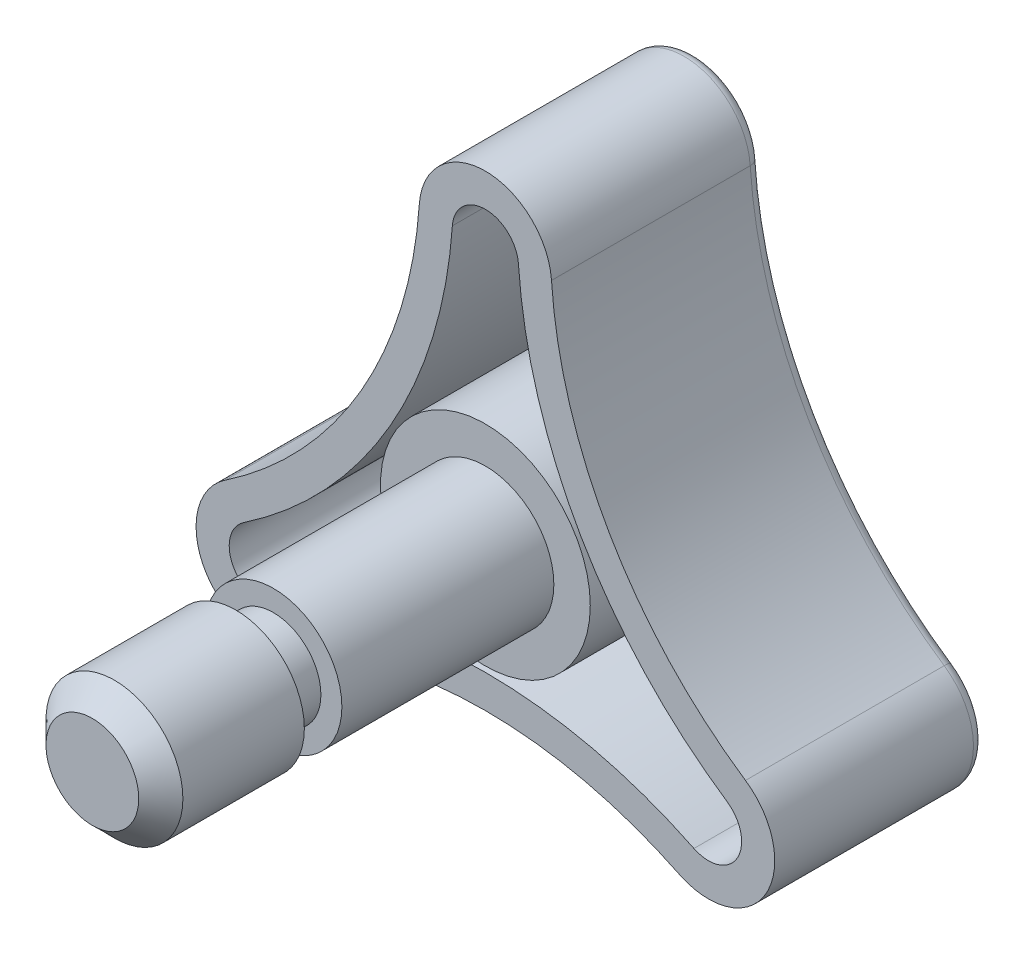
ISO-10303-21;
HEADER;
FILE_DESCRIPTION(('STEP AP214'),'2;1');
FILE_NAME('part.step','',(''),(''),'','','');
FILE_SCHEMA(('AUTOMOTIVE_DESIGN { 1 0 10303 214 1 1 1 1 }'));
ENDSEC;
DATA;
#1=APPLICATION_CONTEXT('core data for automotive mechanical design processes');
#2=APPLICATION_PROTOCOL_DEFINITION('international standard','automotive_design',2000,#1);
#3=PRODUCT_CONTEXT('',#1,'mechanical');
#4=PRODUCT('Part','Part','',(#3));
#5=PRODUCT_RELATED_PRODUCT_CATEGORY('part','',(#4));
#6=PRODUCT_DEFINITION_FORMATION('','',#4);
#7=PRODUCT_DEFINITION_CONTEXT('part definition',#1,'design');
#8=PRODUCT_DEFINITION('design','',#6,#7);
#9=PRODUCT_DEFINITION_SHAPE('','',#8);
#10=(LENGTH_UNIT() NAMED_UNIT(*) SI_UNIT(.MILLI.,.METRE.));
#11=(NAMED_UNIT(*) PLANE_ANGLE_UNIT() SI_UNIT($,.RADIAN.));
#12=(NAMED_UNIT(*) SI_UNIT($,.STERADIAN.) SOLID_ANGLE_UNIT());
#13=UNCERTAINTY_MEASURE_WITH_UNIT(LENGTH_MEASURE(1.E-05),#10,'distance_accuracy_value','');
#14=(GEOMETRIC_REPRESENTATION_CONTEXT(3) GLOBAL_UNCERTAINTY_ASSIGNED_CONTEXT((#13)) GLOBAL_UNIT_ASSIGNED_CONTEXT((#10,
#11,#12)) REPRESENTATION_CONTEXT('',''));
#15=CARTESIAN_POINT('',(0.,0.,0.));
#16=DIRECTION('',(0.,0.,1.));
#17=DIRECTION('',(1.,0.,0.));
#18=AXIS2_PLACEMENT_3D('',#15,#16,#17);
#19=CARTESIAN_POINT('',(0.,0.,27.3));
#20=DIRECTION('',(0.,0.,-1.));
#21=DIRECTION('',(-1.,0.,0.));
#22=AXIS2_PLACEMENT_3D('',#19,#20,#21);
#23=CYLINDRICAL_SURFACE('',#22,3.1);
#24=CARTESIAN_POINT('',(0.,0.,9.5));
#25=DIRECTION('',(0.,0.,1.));
#26=DIRECTION('',(1.,0.,0.));
#27=AXIS2_PLACEMENT_3D('',#24,#25,#26);
#28=CIRCLE('',#27,3.1);
#29=CARTESIAN_POINT('',(3.1,0.,9.5));
#30=VERTEX_POINT('',#29);
#31=EDGE_CURVE('E247',#30,#30,#28,.T.);
#32=ORIENTED_EDGE('',*,*,#31,.T.);
#33=EDGE_LOOP('',(#32));
#34=FACE_BOUND('',#33,.T.);
#35=CARTESIAN_POINT('',(0.,0.,19.1));
#36=DIRECTION('',(0.,0.,1.));
#37=DIRECTION('',(1.,0.,0.));
#38=AXIS2_PLACEMENT_3D('',#35,#36,#37);
#39=CIRCLE('',#38,3.1);
#40=CARTESIAN_POINT('',(3.1,0.,19.1));
#41=VERTEX_POINT('',#40);
#42=EDGE_CURVE('E268',#41,#41,#39,.T.);
#43=ORIENTED_EDGE('',*,*,#42,.F.);
#44=EDGE_LOOP('',(#43));
#45=FACE_BOUND('',#44,.T.);
#46=ADVANCED_FACE('F33',(#34,#45),#23,.T.);
#47=CARTESIAN_POINT('',(0.,-26.4952951633887,9.5));
#48=DIRECTION('',(0.,0.,-1.));
#49=DIRECTION('',(-1.,0.,0.));
#50=AXIS2_PLACEMENT_3D('',#47,#48,#49);
#51=CYLINDRICAL_SURFACE('',#50,20.);
#52=DIRECTION('',(0.,0.,-1.));
#53=VECTOR('',#52,1.);
#54=CARTESIAN_POINT('',(-8.78576496592908,-8.52837183290578,9.5));
#55=LINE('',#54,#53);
#56=CARTESIAN_POINT('',(-8.78576496592908,-8.52837183290578,9.5));
#57=VERTEX_POINT('',#56);
#58=CARTESIAN_POINT('',(-8.78576496592908,-8.52837183290578,0.5));
#59=VERTEX_POINT('',#58);
#60=EDGE_CURVE('E208',#57,#59,#55,.T.);
#61=ORIENTED_EDGE('',*,*,#60,.T.);
#62=CARTESIAN_POINT('',(0.,-26.4952951633887,0.5));
#63=DIRECTION('',(0.,0.,1.));
#64=DIRECTION('',(1.,0.,0.));
#65=AXIS2_PLACEMENT_3D('',#62,#63,#64);
#66=CIRCLE('',#65,20.);
#67=CARTESIAN_POINT('',(8.78576496592909,-8.52837183290578,0.5));
#68=VERTEX_POINT('',#67);
#69=EDGE_CURVE('E243',#59,#68,#66,.F.);
#70=ORIENTED_EDGE('',*,*,#69,.T.);
#71=DIRECTION('',(0.,0.,-1.));
#72=VECTOR('',#71,1.);
#73=CARTESIAN_POINT('',(8.78576496592909,-8.52837183290578,9.5));
#74=LINE('',#73,#72);
#75=CARTESIAN_POINT('',(8.78576496592909,-8.52837183290578,9.5));
#76=VERTEX_POINT('',#75);
#77=EDGE_CURVE('E220',#76,#68,#74,.T.);
#78=ORIENTED_EDGE('',*,*,#77,.F.);
#79=CARTESIAN_POINT('',(0.,-26.4952951633887,9.5));
#80=DIRECTION('',(0.,0.,-1.));
#81=DIRECTION('',(1.,0.,0.));
#82=AXIS2_PLACEMENT_3D('',#79,#80,#81);
#83=CIRCLE('',#82,20.);
#84=EDGE_CURVE('E195',#57,#76,#83,.T.);
#85=ORIENTED_EDGE('',*,*,#84,.F.);
#86=EDGE_LOOP('',(#61,#70,#78,#85));
#87=FACE_BOUND('',#86,.T.);
#88=ADVANCED_FACE('F318',(#87),#51,.F.);
#89=CARTESIAN_POINT('',(10.1036297108185,-5.83333333333333,9.5));
#90=DIRECTION('',(0.,0.,-1.));
#91=DIRECTION('',(-1.,0.,0.));
#92=AXIS2_PLACEMENT_3D('',#89,#90,#91);
#93=CYLINDRICAL_SURFACE('',#92,3.);
#94=ORIENTED_EDGE('',*,*,#77,.T.);
#95=CARTESIAN_POINT('',(10.1036297108185,-5.83333333333333,0.5));
#96=DIRECTION('',(0.,0.,1.));
#97=DIRECTION('',(1.,0.,0.));
#98=AXIS2_PLACEMENT_3D('',#95,#96,#97);
#99=CIRCLE('',#98,3.);
#100=CARTESIAN_POINT('',(11.7786691431806,-3.34450973572102,0.5));
#101=VERTEX_POINT('',#100);
#102=EDGE_CURVE('E241',#68,#101,#99,.T.);
#103=ORIENTED_EDGE('',*,*,#102,.T.);
#104=DIRECTION('',(0.,0.,-1.));
#105=VECTOR('',#104,1.);
#106=CARTESIAN_POINT('',(11.7786691431806,-3.34450973572102,9.5));
#107=LINE('',#106,#105);
#108=CARTESIAN_POINT('',(11.7786691431806,-3.34450973572102,9.5));
#109=VERTEX_POINT('',#108);
#110=EDGE_CURVE('E217',#109,#101,#107,.T.);
#111=ORIENTED_EDGE('',*,*,#110,.F.);
#112=CARTESIAN_POINT('',(10.1036297108185,-5.83333333333333,9.5));
#113=DIRECTION('',(0.,0.,1.));
#114=DIRECTION('',(1.,0.,0.));
#115=AXIS2_PLACEMENT_3D('',#112,#113,#114);
#116=CIRCLE('',#115,3.);
#117=EDGE_CURVE('E198',#76,#109,#116,.T.);
#118=ORIENTED_EDGE('',*,*,#117,.F.);
#119=EDGE_LOOP('',(#94,#103,#111,#118));
#120=FACE_BOUND('',#119,.T.);
#121=ADVANCED_FACE('F324',(#120),#93,.T.);
#122=CARTESIAN_POINT('',(22.9455986922616,13.2476475816944,9.5));
#123=DIRECTION('',(0.,0.,-1.));
#124=DIRECTION('',(-1.,0.,0.));
#125=AXIS2_PLACEMENT_3D('',#122,#123,#124);
#126=CYLINDRICAL_SURFACE('',#125,20.);
#127=ORIENTED_EDGE('',*,*,#110,.T.);
#128=CARTESIAN_POINT('',(22.9455986922616,13.2476475816944,0.5));
#129=DIRECTION('',(0.,0.,1.));
#130=DIRECTION('',(1.,0.,0.));
#131=AXIS2_PLACEMENT_3D('',#128,#129,#130);
#132=CIRCLE('',#131,20.);
#133=CARTESIAN_POINT('',(2.99290417725151,11.8728815686268,0.5));
#134=VERTEX_POINT('',#133);
#135=EDGE_CURVE('E239',#101,#134,#132,.F.);
#136=ORIENTED_EDGE('',*,*,#135,.T.);
#137=DIRECTION('',(0.,0.,-1.));
#138=VECTOR('',#137,1.);
#139=CARTESIAN_POINT('',(2.99290417725151,11.8728815686268,9.5));
#140=LINE('',#139,#138);
#141=CARTESIAN_POINT('',(2.99290417725151,11.8728815686268,9.5));
#142=VERTEX_POINT('',#141);
#143=EDGE_CURVE('E214',#142,#134,#140,.T.);
#144=ORIENTED_EDGE('',*,*,#143,.F.);
#145=CARTESIAN_POINT('',(22.9455986922616,13.2476475816944,9.5));
#146=DIRECTION('',(0.,0.,-1.));
#147=DIRECTION('',(1.,0.,0.));
#148=AXIS2_PLACEMENT_3D('',#145,#146,#147);
#149=CIRCLE('',#148,20.);
#150=EDGE_CURVE('E200',#109,#142,#149,.T.);
#151=ORIENTED_EDGE('',*,*,#150,.F.);
#152=EDGE_LOOP('',(#127,#136,#144,#151));
#153=FACE_BOUND('',#152,.T.);
#154=ADVANCED_FACE('F418',(#153),#126,.F.);
#155=CARTESIAN_POINT('',(0.,11.6666666666667,9.5));
#156=DIRECTION('',(0.,0.,-1.));
#157=DIRECTION('',(-1.,0.,0.));
#158=AXIS2_PLACEMENT_3D('',#155,#156,#157);
#159=CYLINDRICAL_SURFACE('',#158,3.);
#160=ORIENTED_EDGE('',*,*,#143,.T.);
#161=CARTESIAN_POINT('',(0.,11.6666666666667,0.5));
#162=DIRECTION('',(0.,0.,1.));
#163=DIRECTION('',(1.,0.,0.));
#164=AXIS2_PLACEMENT_3D('',#161,#162,#163);
#165=CIRCLE('',#164,3.);
#166=CARTESIAN_POINT('',(-2.99290417725151,11.8728815686268,0.5));
#167=VERTEX_POINT('',#166);
#168=EDGE_CURVE('E223',#134,#167,#165,.T.);
#169=ORIENTED_EDGE('',*,*,#168,.T.);
#170=DIRECTION('',(0.,0.,-1.));
#171=VECTOR('',#170,1.);
#172=CARTESIAN_POINT('',(-2.99290417725151,11.8728815686268,9.5));
#173=LINE('',#172,#171);
#174=CARTESIAN_POINT('',(-2.99290417725151,11.8728815686268,9.5));
#175=VERTEX_POINT('',#174);
#176=EDGE_CURVE('E212',#175,#167,#173,.T.);
#177=ORIENTED_EDGE('',*,*,#176,.F.);
#178=CARTESIAN_POINT('',(0.,11.6666666666667,9.5));
#179=DIRECTION('',(0.,0.,1.));
#180=DIRECTION('',(1.,0.,0.));
#181=AXIS2_PLACEMENT_3D('',#178,#179,#180);
#182=CIRCLE('',#181,3.);
#183=EDGE_CURVE('E202',#142,#175,#182,.T.);
#184=ORIENTED_EDGE('',*,*,#183,.F.);
#185=EDGE_LOOP('',(#160,#169,#177,#184));
#186=FACE_BOUND('',#185,.T.);
#187=ADVANCED_FACE('F428',(#186),#159,.T.);
#188=CARTESIAN_POINT('',(-22.9455986922616,13.2476475816944,9.5));
#189=DIRECTION('',(0.,0.,-1.));
#190=DIRECTION('',(-1.,0.,0.));
#191=AXIS2_PLACEMENT_3D('',#188,#189,#190);
#192=CYLINDRICAL_SURFACE('',#191,20.);
#193=ORIENTED_EDGE('',*,*,#176,.T.);
#194=CARTESIAN_POINT('',(-22.9455986922616,13.2476475816944,0.5));
#195=DIRECTION('',(0.,0.,1.));
#196=DIRECTION('',(1.,0.,0.));
#197=AXIS2_PLACEMENT_3D('',#194,#195,#196);
#198=CIRCLE('',#197,20.);
#199=CARTESIAN_POINT('',(-11.7786691431806,-3.34450973572102,0.5));
#200=VERTEX_POINT('',#199);
#201=EDGE_CURVE('E48',#167,#200,#198,.F.);
#202=ORIENTED_EDGE('',*,*,#201,.T.);
#203=DIRECTION('',(0.,0.,-1.));
#204=VECTOR('',#203,1.);
#205=CARTESIAN_POINT('',(-11.7786691431806,-3.34450973572102,9.5));
#206=LINE('',#205,#204);
#207=CARTESIAN_POINT('',(-11.7786691431806,-3.34450973572102,9.5));
#208=VERTEX_POINT('',#207);
#209=EDGE_CURVE('E210',#208,#200,#206,.T.);
#210=ORIENTED_EDGE('',*,*,#209,.F.);
#211=CARTESIAN_POINT('',(-22.9455986922616,13.2476475816944,9.5));
#212=DIRECTION('',(0.,0.,-1.));
#213=DIRECTION('',(1.,0.,0.));
#214=AXIS2_PLACEMENT_3D('',#211,#212,#213);
#215=CIRCLE('',#214,20.);
#216=EDGE_CURVE('E204',#175,#208,#215,.T.);
#217=ORIENTED_EDGE('',*,*,#216,.F.);
#218=EDGE_LOOP('',(#193,#202,#210,#217));
#219=FACE_BOUND('',#218,.T.);
#220=ADVANCED_FACE('F438',(#219),#192,.F.);
#221=CARTESIAN_POINT('',(-10.1036297108184,-5.83333333333333,9.5));
#222=DIRECTION('',(0.,0.,-1.));
#223=DIRECTION('',(-1.,0.,0.));
#224=AXIS2_PLACEMENT_3D('',#221,#222,#223);
#225=CYLINDRICAL_SURFACE('',#224,3.);
#226=ORIENTED_EDGE('',*,*,#209,.T.);
#227=CARTESIAN_POINT('',(-10.1036297108184,-5.83333333333333,0.5));
#228=DIRECTION('',(0.,0.,1.));
#229=DIRECTION('',(1.,0.,0.));
#230=AXIS2_PLACEMENT_3D('',#227,#228,#229);
#231=CIRCLE('',#230,3.);
#232=EDGE_CURVE('E55',#200,#59,#231,.T.);
#233=ORIENTED_EDGE('',*,*,#232,.T.);
#234=ORIENTED_EDGE('',*,*,#60,.F.);
#235=CARTESIAN_POINT('',(-10.1036297108184,-5.83333333333333,9.5));
#236=DIRECTION('',(0.,0.,1.));
#237=DIRECTION('',(1.,0.,0.));
#238=AXIS2_PLACEMENT_3D('',#235,#236,#237);
#239=CIRCLE('',#238,3.);
#240=EDGE_CURVE('E206',#208,#57,#239,.T.);
#241=ORIENTED_EDGE('',*,*,#240,.F.);
#242=EDGE_LOOP('',(#226,#233,#234,#241));
#243=FACE_BOUND('',#242,.T.);
#244=ADVANCED_FACE('F448',(#243),#225,.T.);
#245=CARTESIAN_POINT('',(-5.05181485540922,-16.164314248361,9.5));
#246=DIRECTION('',(0.,0.,1.));
#247=DIRECTION('',(1.,0.,0.));
#248=AXIS2_PLACEMENT_3D('',#245,#246,#247);
#249=PLANE('',#248);
#250=CARTESIAN_POINT('',(0.,-26.4952951633887,9.5));
#251=DIRECTION('',(0.,0.,1.));
#252=DIRECTION('',(1.,0.,0.));
#253=AXIS2_PLACEMENT_3D('',#250,#251,#252);
#254=CIRCLE('',#253,21.5);
#255=CARTESIAN_POINT('',(-9.44469733837376,-7.18085258311956,9.5));
#256=VERTEX_POINT('',#255);
#257=CARTESIAN_POINT('',(9.44469733837377,-7.18085258311955,9.5));
#258=VERTEX_POINT('',#257);
#259=EDGE_CURVE('E183',#256,#258,#254,.F.);
#260=ORIENTED_EDGE('',*,*,#259,.F.);
#261=CARTESIAN_POINT('',(-10.1036297108184,-5.83333333333333,9.5));
#262=DIRECTION('',(0.,0.,1.));
#263=DIRECTION('',(1.,0.,0.));
#264=AXIS2_PLACEMENT_3D('',#261,#262,#263);
#265=CIRCLE('',#264,1.5);
#266=CARTESIAN_POINT('',(-10.9411494269995,-4.58892153452717,9.5));
#267=VERTEX_POINT('',#266);
#268=EDGE_CURVE('E193',#267,#256,#265,.T.);
#269=ORIENTED_EDGE('',*,*,#268,.F.);
#270=CARTESIAN_POINT('',(-22.9455986922616,13.2476475816944,9.5));
#271=DIRECTION('',(0.,0.,1.));
#272=DIRECTION('',(1.,0.,0.));
#273=AXIS2_PLACEMENT_3D('',#270,#271,#272);
#274=CIRCLE('',#273,21.5);
#275=CARTESIAN_POINT('',(-1.49645208862575,11.7697741176467,9.5));
#276=VERTEX_POINT('',#275);
#277=EDGE_CURVE('E190',#276,#267,#274,.F.);
#278=ORIENTED_EDGE('',*,*,#277,.F.);
#279=CARTESIAN_POINT('',(0.,11.6666666666667,9.5));
#280=DIRECTION('',(0.,0.,1.));
#281=DIRECTION('',(1.,0.,0.));
#282=AXIS2_PLACEMENT_3D('',#279,#280,#281);
#283=CIRCLE('',#282,1.5);
#284=CARTESIAN_POINT('',(1.49645208862575,11.7697741176467,9.5));
#285=VERTEX_POINT('',#284);
#286=EDGE_CURVE('E188',#285,#276,#283,.T.);
#287=ORIENTED_EDGE('',*,*,#286,.F.);
#288=CARTESIAN_POINT('',(22.9455986922616,13.2476475816944,9.5));
#289=DIRECTION('',(0.,0.,1.));
#290=DIRECTION('',(1.,0.,0.));
#291=AXIS2_PLACEMENT_3D('',#288,#289,#290);
#292=CIRCLE('',#291,21.5);
#293=CARTESIAN_POINT('',(10.9411494269995,-4.58892153452718,9.5));
#294=VERTEX_POINT('',#293);
#295=EDGE_CURVE('E186',#294,#285,#292,.F.);
#296=ORIENTED_EDGE('',*,*,#295,.F.);
#297=CARTESIAN_POINT('',(10.1036297108185,-5.83333333333333,9.5));
#298=DIRECTION('',(0.,0.,1.));
#299=DIRECTION('',(1.,0.,0.));
#300=AXIS2_PLACEMENT_3D('',#297,#298,#299);
#301=CIRCLE('',#300,1.5);
#302=EDGE_CURVE('E158',#258,#294,#301,.T.);
#303=ORIENTED_EDGE('',*,*,#302,.F.);
#304=EDGE_LOOP('',(#260,#269,#278,#287,#296,#303));
#305=FACE_BOUND('',#304,.T.);
#306=ORIENTED_EDGE('',*,*,#84,.T.);
#307=ORIENTED_EDGE('',*,*,#117,.T.);
#308=ORIENTED_EDGE('',*,*,#150,.T.);
#309=ORIENTED_EDGE('',*,*,#183,.T.);
#310=ORIENTED_EDGE('',*,*,#216,.T.);
#311=ORIENTED_EDGE('',*,*,#240,.T.);
#312=EDGE_LOOP('',(#306,#307,#308,#309,#310,#311));
#313=FACE_BOUND('',#312,.T.);
#314=ADVANCED_FACE('F299',(#305,#313),#249,.T.);
#315=CARTESIAN_POINT('',(-5.05181485540922,-16.164314248361,0.));
#316=DIRECTION('',(0.,0.,1.));
#317=DIRECTION('',(1.,0.,0.));
#318=AXIS2_PLACEMENT_3D('',#315,#316,#317);
#319=PLANE('',#318);
#320=CARTESIAN_POINT('',(-22.9455986922616,13.2476475816944,0.));
#321=DIRECTION('',(0.,0.,1.));
#322=DIRECTION('',(1.,0.,0.));
#323=AXIS2_PLACEMENT_3D('',#320,#321,#322);
#324=CIRCLE('',#323,20.5);
#325=CARTESIAN_POINT('',(-11.4994959044536,-3.75931366865641,0.));
#326=VERTEX_POINT('',#325);
#327=CARTESIAN_POINT('',(-2.49408681437626,11.8385124183001,0.));
#328=VERTEX_POINT('',#327);
#329=EDGE_CURVE('E226',#326,#328,#324,.T.);
#330=ORIENTED_EDGE('',*,*,#329,.T.);
#331=CARTESIAN_POINT('',(0.,11.6666666666667,0.));
#332=DIRECTION('',(0.,0.,1.));
#333=DIRECTION('',(1.,0.,0.));
#334=AXIS2_PLACEMENT_3D('',#331,#332,#333);
#335=CIRCLE('',#334,2.5);
#336=CARTESIAN_POINT('',(2.49408681437626,11.8385124183001,0.));
#337=VERTEX_POINT('',#336);
#338=EDGE_CURVE('E236',#328,#337,#335,.F.);
#339=ORIENTED_EDGE('',*,*,#338,.T.);
#340=CARTESIAN_POINT('',(22.9455986922616,13.2476475816944,0.));
#341=DIRECTION('',(0.,0.,1.));
#342=DIRECTION('',(1.,0.,0.));
#343=AXIS2_PLACEMENT_3D('',#340,#341,#342);
#344=CIRCLE('',#343,20.5);
#345=CARTESIAN_POINT('',(11.4994959044536,-3.75931366865641,0.));
#346=VERTEX_POINT('',#345);
#347=EDGE_CURVE('E234',#337,#346,#344,.T.);
#348=ORIENTED_EDGE('',*,*,#347,.T.);
#349=CARTESIAN_POINT('',(10.1036297108185,-5.83333333333333,0.));
#350=DIRECTION('',(0.,0.,1.));
#351=DIRECTION('',(1.,0.,0.));
#352=AXIS2_PLACEMENT_3D('',#349,#350,#351);
#353=CIRCLE('',#352,2.5);
#354=CARTESIAN_POINT('',(9.00540909007732,-8.0791987496437,0.));
#355=VERTEX_POINT('',#354);
#356=EDGE_CURVE('E232',#346,#355,#353,.F.);
#357=ORIENTED_EDGE('',*,*,#356,.T.);
#358=CARTESIAN_POINT('',(0.,-26.4952951633887,0.));
#359=DIRECTION('',(0.,0.,1.));
#360=DIRECTION('',(1.,0.,0.));
#361=AXIS2_PLACEMENT_3D('',#358,#359,#360);
#362=CIRCLE('',#361,20.5);
#363=CARTESIAN_POINT('',(-9.00540909007731,-8.0791987496437,0.));
#364=VERTEX_POINT('',#363);
#365=EDGE_CURVE('E230',#355,#364,#362,.T.);
#366=ORIENTED_EDGE('',*,*,#365,.T.);
#367=CARTESIAN_POINT('',(-10.1036297108184,-5.83333333333333,0.));
#368=DIRECTION('',(0.,0.,1.));
#369=DIRECTION('',(1.,0.,0.));
#370=AXIS2_PLACEMENT_3D('',#367,#368,#369);
#371=CIRCLE('',#370,2.5);
#372=EDGE_CURVE('E228',#364,#326,#371,.F.);
#373=ORIENTED_EDGE('',*,*,#372,.T.);
#374=EDGE_LOOP('',(#330,#339,#348,#357,#366,#373));
#375=FACE_BOUND('',#374,.T.);
#376=ADVANCED_FACE('F379',(#375),#319,.F.);
#377=CARTESIAN_POINT('',(0.,-26.4952951633887,9.5));
#378=DIRECTION('',(0.,0.,-1.));
#379=DIRECTION('',(-1.,0.,0.));
#380=AXIS2_PLACEMENT_3D('',#377,#378,#379);
#381=CYLINDRICAL_SURFACE('',#380,21.5);
#382=CARTESIAN_POINT('',(0.,-26.4952951633887,1.5));
#383=DIRECTION('',(0.,0.,1.));
#384=DIRECTION('',(1.,0.,0.));
#385=AXIS2_PLACEMENT_3D('',#382,#383,#384);
#386=CIRCLE('',#385,21.5);
#387=CARTESIAN_POINT('',(-9.44469733837377,-7.18085258311955,1.5));
#388=VERTEX_POINT('',#387);
#389=CARTESIAN_POINT('',(9.44469733837377,-7.18085258311955,1.5));
#390=VERTEX_POINT('',#389);
#391=EDGE_CURVE('E149',#388,#390,#386,.F.);
#392=ORIENTED_EDGE('',*,*,#391,.F.);
#393=DIRECTION('',(0.,0.,-1.));
#394=VECTOR('',#393,1.);
#395=CARTESIAN_POINT('',(-9.44469733837377,-7.18085258311955,9.5));
#396=LINE('',#395,#394);
#397=EDGE_CURVE('E181',#256,#388,#396,.T.);
#398=ORIENTED_EDGE('',*,*,#397,.F.);
#399=ORIENTED_EDGE('',*,*,#259,.T.);
#400=DIRECTION('',(0.,0.,-1.));
#401=VECTOR('',#400,1.);
#402=CARTESIAN_POINT('',(9.44469733837377,-7.18085258311955,9.5));
#403=LINE('',#402,#401);
#404=EDGE_CURVE('E161',#258,#390,#403,.T.);
#405=ORIENTED_EDGE('',*,*,#404,.T.);
#406=EDGE_LOOP('',(#392,#398,#399,#405));
#407=FACE_BOUND('',#406,.T.);
#408=ADVANCED_FACE('F297',(#407),#381,.T.);
#409=CARTESIAN_POINT('',(10.1036297108185,-5.83333333333333,9.5));
#410=DIRECTION('',(0.,0.,-1.));
#411=DIRECTION('',(-1.,0.,0.));
#412=AXIS2_PLACEMENT_3D('',#409,#410,#411);
#413=CYLINDRICAL_SURFACE('',#412,1.5);
#414=CARTESIAN_POINT('',(10.1036297108185,-5.83333333333333,1.5));
#415=DIRECTION('',(0.,0.,1.));
#416=DIRECTION('',(1.,0.,0.));
#417=AXIS2_PLACEMENT_3D('',#414,#415,#416);
#418=CIRCLE('',#417,1.5);
#419=CARTESIAN_POINT('',(10.9411494269995,-4.58892153452718,1.5));
#420=VERTEX_POINT('',#419);
#421=EDGE_CURVE('E142',#390,#420,#418,.T.);
#422=ORIENTED_EDGE('',*,*,#421,.F.);
#423=ORIENTED_EDGE('',*,*,#404,.F.);
#424=ORIENTED_EDGE('',*,*,#302,.T.);
#425=DIRECTION('',(0.,0.,-1.));
#426=VECTOR('',#425,1.);
#427=CARTESIAN_POINT('',(10.9411494269995,-4.58892153452718,9.5));
#428=LINE('',#427,#426);
#429=EDGE_CURVE('E155',#294,#420,#428,.T.);
#430=ORIENTED_EDGE('',*,*,#429,.T.);
#431=EDGE_LOOP('',(#422,#423,#424,#430));
#432=FACE_BOUND('',#431,.T.);
#433=ADVANCED_FACE('F156',(#432),#413,.F.);
#434=CARTESIAN_POINT('',(22.9455986922616,13.2476475816944,9.5));
#435=DIRECTION('',(0.,0.,-1.));
#436=DIRECTION('',(-1.,0.,0.));
#437=AXIS2_PLACEMENT_3D('',#434,#435,#436);
#438=CYLINDRICAL_SURFACE('',#437,21.5);
#439=CARTESIAN_POINT('',(22.9455986922616,13.2476475816944,1.5));
#440=DIRECTION('',(0.,0.,1.));
#441=DIRECTION('',(1.,0.,0.));
#442=AXIS2_PLACEMENT_3D('',#439,#440,#441);
#443=CIRCLE('',#442,21.5);
#444=CARTESIAN_POINT('',(1.49645208862576,11.7697741176467,1.5));
#445=VERTEX_POINT('',#444);
#446=EDGE_CURVE('E146',#420,#445,#443,.F.);
#447=ORIENTED_EDGE('',*,*,#446,.F.);
#448=ORIENTED_EDGE('',*,*,#429,.F.);
#449=ORIENTED_EDGE('',*,*,#295,.T.);
#450=DIRECTION('',(0.,0.,-1.));
#451=VECTOR('',#450,1.);
#452=CARTESIAN_POINT('',(1.49645208862576,11.7697741176467,9.5));
#453=LINE('',#452,#451);
#454=EDGE_CURVE('E162',#285,#445,#453,.T.);
#455=ORIENTED_EDGE('',*,*,#454,.T.);
#456=EDGE_LOOP('',(#447,#448,#449,#455));
#457=FACE_BOUND('',#456,.T.);
#458=ADVANCED_FACE('F164',(#457),#438,.T.);
#459=CARTESIAN_POINT('',(0.,11.6666666666667,9.5));
#460=DIRECTION('',(0.,0.,-1.));
#461=DIRECTION('',(-1.,0.,0.));
#462=AXIS2_PLACEMENT_3D('',#459,#460,#461);
#463=CYLINDRICAL_SURFACE('',#462,1.5);
#464=CARTESIAN_POINT('',(0.,11.6666666666667,1.5));
#465=DIRECTION('',(0.,0.,1.));
#466=DIRECTION('',(1.,0.,0.));
#467=AXIS2_PLACEMENT_3D('',#464,#465,#466);
#468=CIRCLE('',#467,1.5);
#469=CARTESIAN_POINT('',(-1.49645208862575,11.7697741176467,1.5));
#470=VERTEX_POINT('',#469);
#471=EDGE_CURVE('E167',#445,#470,#468,.T.);
#472=ORIENTED_EDGE('',*,*,#471,.F.);
#473=ORIENTED_EDGE('',*,*,#454,.F.);
#474=ORIENTED_EDGE('',*,*,#286,.T.);
#475=DIRECTION('',(0.,0.,-1.));
#476=VECTOR('',#475,1.);
#477=CARTESIAN_POINT('',(-1.49645208862575,11.7697741176467,9.5));
#478=LINE('',#477,#476);
#479=EDGE_CURVE('E172',#276,#470,#478,.T.);
#480=ORIENTED_EDGE('',*,*,#479,.T.);
#481=EDGE_LOOP('',(#472,#473,#474,#480));
#482=FACE_BOUND('',#481,.T.);
#483=ADVANCED_FACE('F304',(#482),#463,.F.);
#484=CARTESIAN_POINT('',(-22.9455986922616,13.2476475816944,9.5));
#485=DIRECTION('',(0.,0.,-1.));
#486=DIRECTION('',(-1.,0.,0.));
#487=AXIS2_PLACEMENT_3D('',#484,#485,#486);
#488=CYLINDRICAL_SURFACE('',#487,21.5);
#489=CARTESIAN_POINT('',(-22.9455986922616,13.2476475816944,1.5));
#490=DIRECTION('',(0.,0.,1.));
#491=DIRECTION('',(1.,0.,0.));
#492=AXIS2_PLACEMENT_3D('',#489,#490,#491);
#493=CIRCLE('',#492,21.5);
#494=CARTESIAN_POINT('',(-10.9411494269995,-4.58892153452718,1.5));
#495=VERTEX_POINT('',#494);
#496=EDGE_CURVE('E169',#470,#495,#493,.F.);
#497=ORIENTED_EDGE('',*,*,#496,.F.);
#498=ORIENTED_EDGE('',*,*,#479,.F.);
#499=ORIENTED_EDGE('',*,*,#277,.T.);
#500=DIRECTION('',(0.,0.,-1.));
#501=VECTOR('',#500,1.);
#502=CARTESIAN_POINT('',(-10.9411494269995,-4.58892153452718,9.5));
#503=LINE('',#502,#501);
#504=EDGE_CURVE('E176',#267,#495,#503,.T.);
#505=ORIENTED_EDGE('',*,*,#504,.T.);
#506=EDGE_LOOP('',(#497,#498,#499,#505));
#507=FACE_BOUND('',#506,.T.);
#508=ADVANCED_FACE('F308',(#507),#488,.T.);
#509=CARTESIAN_POINT('',(-10.1036297108184,-5.83333333333333,9.5));
#510=DIRECTION('',(0.,0.,-1.));
#511=DIRECTION('',(-1.,0.,0.));
#512=AXIS2_PLACEMENT_3D('',#509,#510,#511);
#513=CYLINDRICAL_SURFACE('',#512,1.5);
#514=CARTESIAN_POINT('',(-10.1036297108184,-5.83333333333333,1.5));
#515=DIRECTION('',(0.,0.,1.));
#516=DIRECTION('',(1.,0.,0.));
#517=AXIS2_PLACEMENT_3D('',#514,#515,#516);
#518=CIRCLE('',#517,1.5);
#519=EDGE_CURVE('E178',#495,#388,#518,.T.);
#520=ORIENTED_EDGE('',*,*,#519,.F.);
#521=ORIENTED_EDGE('',*,*,#504,.F.);
#522=ORIENTED_EDGE('',*,*,#268,.T.);
#523=ORIENTED_EDGE('',*,*,#397,.T.);
#524=EDGE_LOOP('',(#520,#521,#522,#523));
#525=FACE_BOUND('',#524,.T.);
#526=ADVANCED_FACE('F293',(#525),#513,.F.);
#527=CARTESIAN_POINT('',(-5.05181485540922,-16.164314248361,1.5));
#528=DIRECTION('',(0.,0.,1.));
#529=DIRECTION('',(1.,0.,0.));
#530=AXIS2_PLACEMENT_3D('',#527,#528,#529);
#531=PLANE('',#530);
#532=CARTESIAN_POINT('',(0.,0.,1.5));
#533=DIRECTION('',(0.,0.,1.));
#534=DIRECTION('',(1.,0.,0.));
#535=AXIS2_PLACEMENT_3D('',#532,#533,#534);
#536=CIRCLE('',#535,4.75);
#537=CARTESIAN_POINT('',(4.75,0.,1.5));
#538=VERTEX_POINT('',#537);
#539=EDGE_CURVE('E271',#538,#538,#536,.T.);
#540=ORIENTED_EDGE('',*,*,#539,.F.);
#541=EDGE_LOOP('',(#540));
#542=FACE_BOUND('',#541,.T.);
#543=ORIENTED_EDGE('',*,*,#391,.T.);
#544=ORIENTED_EDGE('',*,*,#421,.T.);
#545=ORIENTED_EDGE('',*,*,#446,.T.);
#546=ORIENTED_EDGE('',*,*,#471,.T.);
#547=ORIENTED_EDGE('',*,*,#496,.T.);
#548=ORIENTED_EDGE('',*,*,#519,.T.);
#549=EDGE_LOOP('',(#543,#544,#545,#546,#547,#548));
#550=FACE_BOUND('',#549,.T.);
#551=ADVANCED_FACE('F144',(#542,#550),#531,.T.);
#552=CARTESIAN_POINT('',(0.,-26.4952951633887,0.5));
#553=DIRECTION('',(0.,0.,1.));
#554=DIRECTION('',(1.,0.,0.));
#555=AXIS2_PLACEMENT_3D('',#552,#553,#554);
#556=TOROIDAL_SURFACE('',#555,20.5,0.5);
#557=CARTESIAN_POINT('',(-9.00540909007731,-8.0791987496437,0.5));
#558=DIRECTION('',(-0.898346166524148,-0.439288248296455,0.));
#559=DIRECTION('',(0.439288248296455,-0.898346166524148,0.));
#560=AXIS2_PLACEMENT_3D('',#557,#558,#559);
#561=CIRCLE('',#560,0.5);
#562=EDGE_CURVE('E259',#364,#59,#561,.T.);
#563=ORIENTED_EDGE('',*,*,#562,.F.);
#564=ORIENTED_EDGE('',*,*,#365,.F.);
#565=CARTESIAN_POINT('',(9.00540909007732,-8.0791987496437,0.5));
#566=DIRECTION('',(0.898346166524148,-0.439288248296455,0.));
#567=DIRECTION('',(0.439288248296455,0.898346166524148,0.));
#568=AXIS2_PLACEMENT_3D('',#565,#566,#567);
#569=CIRCLE('',#568,0.5);
#570=EDGE_CURVE('E262',#68,#355,#569,.T.);
#571=ORIENTED_EDGE('',*,*,#570,.F.);
#572=ORIENTED_EDGE('',*,*,#69,.F.);
#573=EDGE_LOOP('',(#563,#564,#571,#572));
#574=FACE_BOUND('',#573,.T.);
#575=ADVANCED_FACE('F473',(#574),#556,.T.);
#576=CARTESIAN_POINT('',(10.1036297108185,-5.83333333333333,0.5));
#577=DIRECTION('',(0.,0.,1.));
#578=DIRECTION('',(1.,0.,0.));
#579=AXIS2_PLACEMENT_3D('',#576,#577,#578);
#580=TOROIDAL_SURFACE('',#579,2.5,0.5);
#581=ORIENTED_EDGE('',*,*,#570,.T.);
#582=ORIENTED_EDGE('',*,*,#356,.F.);
#583=CARTESIAN_POINT('',(11.4994959044536,-3.75931366865641,0.5));
#584=DIRECTION('',(-0.829607865870773,0.558346477454047,0.));
#585=DIRECTION('',(-0.558346477454047,-0.829607865870773,0.));
#586=AXIS2_PLACEMENT_3D('',#583,#584,#585);
#587=CIRCLE('',#586,0.5);
#588=EDGE_CURVE('E256',#101,#346,#587,.T.);
#589=ORIENTED_EDGE('',*,*,#588,.F.);
#590=ORIENTED_EDGE('',*,*,#102,.F.);
#591=EDGE_LOOP('',(#581,#582,#589,#590));
#592=FACE_BOUND('',#591,.T.);
#593=ADVANCED_FACE('F478',(#592),#580,.T.);
#594=CARTESIAN_POINT('',(-10.1036297108184,-5.83333333333333,0.5));
#595=DIRECTION('',(0.,0.,1.));
#596=DIRECTION('',(1.,0.,0.));
#597=AXIS2_PLACEMENT_3D('',#594,#595,#596);
#598=TOROIDAL_SURFACE('',#597,2.5,0.5);
#599=ORIENTED_EDGE('',*,*,#562,.T.);
#600=ORIENTED_EDGE('',*,*,#232,.F.);
#601=CARTESIAN_POINT('',(-11.4994959044536,-3.75931366865641,0.5));
#602=DIRECTION('',(0.82960786587077,0.55834647745405,0.));
#603=DIRECTION('',(-0.55834647745405,0.82960786587077,0.));
#604=AXIS2_PLACEMENT_3D('',#601,#602,#603);
#605=CIRCLE('',#604,0.5);
#606=EDGE_CURVE('E253',#326,#200,#605,.T.);
#607=ORIENTED_EDGE('',*,*,#606,.F.);
#608=ORIENTED_EDGE('',*,*,#372,.F.);
#609=EDGE_LOOP('',(#599,#600,#607,#608));
#610=FACE_BOUND('',#609,.T.);
#611=ADVANCED_FACE('F487',(#610),#598,.T.);
#612=CARTESIAN_POINT('',(22.9455986922616,13.2476475816944,0.5));
#613=DIRECTION('',(0.,0.,1.));
#614=DIRECTION('',(1.,0.,0.));
#615=AXIS2_PLACEMENT_3D('',#612,#613,#614);
#616=TOROIDAL_SURFACE('',#615,20.5,0.5);
#617=ORIENTED_EDGE('',*,*,#588,.T.);
#618=ORIENTED_EDGE('',*,*,#347,.F.);
#619=CARTESIAN_POINT('',(2.49408681437626,11.8385124183001,0.5));
#620=DIRECTION('',(-0.0687383006533794,0.997634725750505,0.));
#621=DIRECTION('',(-0.997634725750505,-0.0687383006533794,0.));
#622=AXIS2_PLACEMENT_3D('',#619,#620,#621);
#623=CIRCLE('',#622,0.5);
#624=EDGE_CURVE('E250',#134,#337,#623,.T.);
#625=ORIENTED_EDGE('',*,*,#624,.F.);
#626=ORIENTED_EDGE('',*,*,#135,.F.);
#627=EDGE_LOOP('',(#617,#618,#625,#626));
#628=FACE_BOUND('',#627,.T.);
#629=ADVANCED_FACE('F497',(#628),#616,.T.);
#630=CARTESIAN_POINT('',(-22.9455986922616,13.2476475816944,0.5));
#631=DIRECTION('',(0.,0.,1.));
#632=DIRECTION('',(1.,0.,0.));
#633=AXIS2_PLACEMENT_3D('',#630,#631,#632);
#634=TOROIDAL_SURFACE('',#633,20.5,0.5);
#635=ORIENTED_EDGE('',*,*,#606,.T.);
#636=ORIENTED_EDGE('',*,*,#201,.F.);
#637=CARTESIAN_POINT('',(-2.49408681437626,11.8385124183001,0.5));
#638=DIRECTION('',(0.068738300653376,0.997634725750505,0.));
#639=DIRECTION('',(-0.997634725750505,0.068738300653376,0.));
#640=AXIS2_PLACEMENT_3D('',#637,#638,#639);
#641=CIRCLE('',#640,0.5);
#642=EDGE_CURVE('E248',#328,#167,#641,.T.);
#643=ORIENTED_EDGE('',*,*,#642,.F.);
#644=ORIENTED_EDGE('',*,*,#329,.F.);
#645=EDGE_LOOP('',(#635,#636,#643,#644));
#646=FACE_BOUND('',#645,.T.);
#647=ADVANCED_FACE('F507',(#646),#634,.T.);
#648=CARTESIAN_POINT('',(0.,11.6666666666667,0.5));
#649=DIRECTION('',(0.,0.,1.));
#650=DIRECTION('',(1.,0.,0.));
#651=AXIS2_PLACEMENT_3D('',#648,#649,#650);
#652=TOROIDAL_SURFACE('',#651,2.5,0.5);
#653=ORIENTED_EDGE('',*,*,#624,.T.);
#654=ORIENTED_EDGE('',*,*,#338,.F.);
#655=ORIENTED_EDGE('',*,*,#642,.T.);
#656=ORIENTED_EDGE('',*,*,#168,.F.);
#657=EDGE_LOOP('',(#653,#654,#655,#656));
#658=FACE_BOUND('',#657,.T.);
#659=ADVANCED_FACE('F372',(#658),#652,.T.);
#660=CARTESIAN_POINT('',(0.,0.,9.5));
#661=DIRECTION('',(0.,0.,-1.));
#662=DIRECTION('',(-1.,0.,0.));
#663=AXIS2_PLACEMENT_3D('',#660,#661,#662);
#664=CYLINDRICAL_SURFACE('',#663,4.75);
#665=CARTESIAN_POINT('',(0.,0.,9.5));
#666=DIRECTION('',(0.,0.,1.));
#667=DIRECTION('',(1.,0.,0.));
#668=AXIS2_PLACEMENT_3D('',#665,#666,#667);
#669=CIRCLE('',#668,4.75);
#670=CARTESIAN_POINT('',(4.75,0.,9.5));
#671=VERTEX_POINT('',#670);
#672=EDGE_CURVE('E251',#671,#671,#669,.T.);
#673=ORIENTED_EDGE('',*,*,#672,.F.);
#674=EDGE_LOOP('',(#673));
#675=FACE_BOUND('',#674,.T.);
#676=ORIENTED_EDGE('',*,*,#539,.T.);
#677=EDGE_LOOP('',(#676));
#678=FACE_BOUND('',#677,.T.);
#679=ADVANCED_FACE('F367',(#675,#678),#664,.T.);
#680=CARTESIAN_POINT('',(0.,0.,9.5));
#681=DIRECTION('',(0.,0.,1.));
#682=DIRECTION('',(1.,0.,0.));
#683=AXIS2_PLACEMENT_3D('',#680,#681,#682);
#684=PLANE('',#683);
#685=ORIENTED_EDGE('',*,*,#31,.F.);
#686=EDGE_LOOP('',(#685));
#687=FACE_BOUND('',#686,.T.);
#688=ORIENTED_EDGE('',*,*,#672,.T.);
#689=EDGE_LOOP('',(#688));
#690=FACE_BOUND('',#689,.T.);
#691=ADVANCED_FACE('F354',(#687,#690),#684,.T.);
#692=CARTESIAN_POINT('',(0.,0.,19.1));
#693=DIRECTION('',(0.,0.,1.));
#694=DIRECTION('',(1.,0.,0.));
#695=AXIS2_PLACEMENT_3D('',#692,#693,#694);
#696=PLANE('',#695);
#697=CARTESIAN_POINT('',(0.,0.,19.1));
#698=DIRECTION('',(0.,0.,1.));
#699=DIRECTION('',(1.,0.,0.));
#700=AXIS2_PLACEMENT_3D('',#697,#698,#699);
#701=CIRCLE('',#700,2.15);
#702=CARTESIAN_POINT('',(2.15,0.,19.1));
#703=VERTEX_POINT('',#702);
#704=EDGE_CURVE('E269',#703,#703,#701,.T.);
#705=ORIENTED_EDGE('',*,*,#704,.F.);
#706=EDGE_LOOP('',(#705));
#707=FACE_BOUND('',#706,.T.);
#708=ORIENTED_EDGE('',*,*,#42,.T.);
#709=EDGE_LOOP('',(#708));
#710=FACE_BOUND('',#709,.T.);
#711=ADVANCED_FACE('F345',(#707,#710),#696,.T.);
#712=CARTESIAN_POINT('',(0.,0.,20.8));
#713=DIRECTION('',(0.,0.,1.));
#714=DIRECTION('',(1.,0.,0.));
#715=AXIS2_PLACEMENT_3D('',#712,#713,#714);
#716=PLANE('',#715);
#717=CARTESIAN_POINT('',(0.,0.,20.8));
#718=DIRECTION('',(0.,0.,1.));
#719=DIRECTION('',(1.,0.,0.));
#720=AXIS2_PLACEMENT_3D('',#717,#718,#719);
#721=CIRCLE('',#720,2.15);
#722=CARTESIAN_POINT('',(2.15,0.,20.8));
#723=VERTEX_POINT('',#722);
#724=EDGE_CURVE('E281',#723,#723,#721,.T.);
#725=ORIENTED_EDGE('',*,*,#724,.T.);
#726=EDGE_LOOP('',(#725));
#727=FACE_BOUND('',#726,.T.);
#728=CARTESIAN_POINT('',(0.,0.,20.8));
#729=DIRECTION('',(0.,0.,1.));
#730=DIRECTION('',(1.,0.,0.));
#731=AXIS2_PLACEMENT_3D('',#728,#729,#730);
#732=CIRCLE('',#731,3.1);
#733=CARTESIAN_POINT('',(3.1,0.,20.8));
#734=VERTEX_POINT('',#733);
#735=EDGE_CURVE('E265',#734,#734,#732,.T.);
#736=ORIENTED_EDGE('',*,*,#735,.F.);
#737=EDGE_LOOP('',(#736));
#738=FACE_BOUND('',#737,.T.);
#739=ADVANCED_FACE('F343',(#727,#738),#716,.F.);
#740=CARTESIAN_POINT('',(0.,0.,19.1));
#741=DIRECTION('',(0.,0.,1.));
#742=DIRECTION('',(1.,0.,0.));
#743=AXIS2_PLACEMENT_3D('',#740,#741,#742);
#744=CYLINDRICAL_SURFACE('',#743,2.15);
#745=ORIENTED_EDGE('',*,*,#704,.T.);
#746=EDGE_LOOP('',(#745));
#747=FACE_BOUND('',#746,.T.);
#748=ORIENTED_EDGE('',*,*,#724,.F.);
#749=EDGE_LOOP('',(#748));
#750=FACE_BOUND('',#749,.T.);
#751=ADVANCED_FACE('F338',(#747,#750),#744,.T.);
#752=CARTESIAN_POINT('',(0.,0.,27.3));
#753=DIRECTION('',(0.,0.,1.));
#754=DIRECTION('',(1.,0.,0.));
#755=AXIS2_PLACEMENT_3D('',#752,#753,#754);
#756=PLANE('',#755);
#757=CARTESIAN_POINT('',(0.,0.,27.3));
#758=DIRECTION('',(0.,0.,1.));
#759=DIRECTION('',(1.,0.,0.));
#760=AXIS2_PLACEMENT_3D('',#757,#758,#759);
#761=CIRCLE('',#760,2.1);
#762=CARTESIAN_POINT('',(2.1,0.,27.3));
#763=VERTEX_POINT('',#762);
#764=EDGE_CURVE('E41',#763,#763,#761,.T.);
#765=ORIENTED_EDGE('',*,*,#764,.T.);
#766=EDGE_LOOP('',(#765));
#767=FACE_BOUND('',#766,.T.);
#768=ADVANCED_FACE('F331',(#767),#756,.T.);
#769=CARTESIAN_POINT('',(0.,0.,26.3));
#770=DIRECTION('',(0.,0.,1.));
#771=DIRECTION('',(1.,0.,0.));
#772=AXIS2_PLACEMENT_3D('',#769,#770,#771);
#773=CIRCLE('',#772,3.1);
#774=CARTESIAN_POINT('',(3.1,0.,26.3));
#775=VERTEX_POINT('',#774);
#776=EDGE_CURVE('E11',#775,#775,#773,.F.);
#777=ORIENTED_EDGE('',*,*,#776,.T.);
#778=EDGE_LOOP('',(#777));
#779=FACE_BOUND('',#778,.T.);
#780=ORIENTED_EDGE('',*,*,#735,.T.);
#781=EDGE_LOOP('',(#780));
#782=FACE_BOUND('',#781,.T.);
#783=ADVANCED_FACE('F320',(#779,#782),#23,.T.);
#784=CARTESIAN_POINT('',(0.,0.,27.3));
#785=DIRECTION('',(0.,0.,-1.));
#786=DIRECTION('',(-1.,0.,0.));
#787=AXIS2_PLACEMENT_3D('',#784,#785,#786);
#788=CONICAL_SURFACE('',#787,2.1,0.785398163397446);
#789=ORIENTED_EDGE('',*,*,#776,.F.);
#790=EDGE_LOOP('',(#789));
#791=FACE_BOUND('',#790,.T.);
#792=ORIENTED_EDGE('',*,*,#764,.F.);
#793=EDGE_LOOP('',(#792));
#794=FACE_BOUND('',#793,.T.);
#795=ADVANCED_FACE('F35',(#791,#794),#788,.T.);
#796=CLOSED_SHELL('',(#46,#88,#121,#154,#187,#220,#244,#314,#376,#408,#433,#458,#483,#508,#526,
#551,#575,#593,#611,#629,#647,#659,#679,#691,#711,#739,#751,#768,#783,#795));
#797=MANIFOLD_SOLID_BREP('B2',#796);
#798=ADVANCED_BREP_SHAPE_REPRESENTATION('',(#18,#797),#14);
#799=SHAPE_DEFINITION_REPRESENTATION(#9,#798);
ENDSEC;
END-ISO-10303-21;
